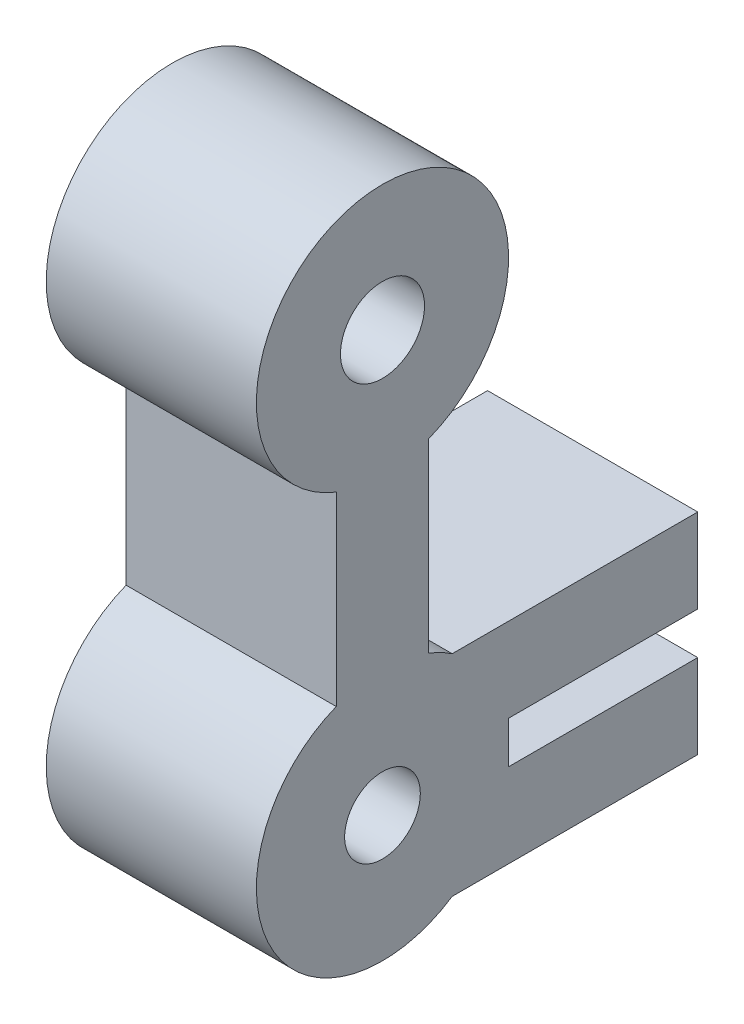
ISO-10303-21;
HEADER;
FILE_DESCRIPTION(('STEP AP214'),'2;1');
FILE_NAME('part.step','',(''),(''),'','','');
FILE_SCHEMA(('AUTOMOTIVE_DESIGN { 1 0 10303 214 1 1 1 1 }'));
ENDSEC;
DATA;
#1=APPLICATION_CONTEXT('core data for automotive mechanical design processes');
#2=APPLICATION_PROTOCOL_DEFINITION('international standard','automotive_design',2000,#1);
#3=PRODUCT_CONTEXT('',#1,'mechanical');
#4=PRODUCT('Part','Part','',(#3));
#5=PRODUCT_RELATED_PRODUCT_CATEGORY('part','',(#4));
#6=PRODUCT_DEFINITION_FORMATION('','',#4);
#7=PRODUCT_DEFINITION_CONTEXT('part definition',#1,'design');
#8=PRODUCT_DEFINITION('design','',#6,#7);
#9=PRODUCT_DEFINITION_SHAPE('','',#8);
#10=(LENGTH_UNIT() NAMED_UNIT(*) SI_UNIT(.MILLI.,.METRE.));
#11=(NAMED_UNIT(*) PLANE_ANGLE_UNIT() SI_UNIT($,.RADIAN.));
#12=(NAMED_UNIT(*) SI_UNIT($,.STERADIAN.) SOLID_ANGLE_UNIT());
#13=UNCERTAINTY_MEASURE_WITH_UNIT(LENGTH_MEASURE(1.E-05),#10,'distance_accuracy_value','');
#14=(GEOMETRIC_REPRESENTATION_CONTEXT(3) GLOBAL_UNCERTAINTY_ASSIGNED_CONTEXT((#13)) GLOBAL_UNIT_ASSIGNED_CONTEXT((#10,
#11,#12)) REPRESENTATION_CONTEXT('',''));
#15=CARTESIAN_POINT('',(0.,0.,0.));
#16=DIRECTION('',(0.,0.,1.));
#17=DIRECTION('',(1.,0.,0.));
#18=AXIS2_PLACEMENT_3D('',#15,#16,#17);
#19=CARTESIAN_POINT('',(-50.,25.,-75.));
#20=DIRECTION('',(0.,0.,-1.));
#21=DIRECTION('',(-1.,0.,0.));
#22=AXIS2_PLACEMENT_3D('',#19,#20,#21);
#23=PLANE('',#22);
#24=DIRECTION('',(0.,1.,0.));
#25=VECTOR('',#24,1.);
#26=CARTESIAN_POINT('',(0.,25.,-75.));
#27=LINE('',#26,#25);
#28=CARTESIAN_POINT('',(0.,4.99999999999996,-75.));
#29=VERTEX_POINT('',#28);
#30=CARTESIAN_POINT('',(0.,25.,-75.));
#31=VERTEX_POINT('',#30);
#32=EDGE_CURVE('E160',#29,#31,#27,.T.);
#33=ORIENTED_EDGE('',*,*,#32,.F.);
#34=DIRECTION('',(1.,0.,0.));
#35=VECTOR('',#34,1.);
#36=CARTESIAN_POINT('',(-50.,4.99999999999996,-75.));
#37=LINE('',#36,#35);
#38=CARTESIAN_POINT('',(-50.,4.99999999999996,-75.));
#39=VERTEX_POINT('',#38);
#40=EDGE_CURVE('E11',#39,#29,#37,.T.);
#41=ORIENTED_EDGE('',*,*,#40,.F.);
#42=DIRECTION('',(0.,1.,0.));
#43=VECTOR('',#42,1.);
#44=CARTESIAN_POINT('',(-50.,25.,-75.));
#45=LINE('',#44,#43);
#46=CARTESIAN_POINT('',(-50.,25.,-75.));
#47=VERTEX_POINT('',#46);
#48=EDGE_CURVE('E193',#39,#47,#45,.T.);
#49=ORIENTED_EDGE('',*,*,#48,.T.);
#50=DIRECTION('',(1.,0.,0.));
#51=VECTOR('',#50,1.);
#52=CARTESIAN_POINT('',(-50.,25.,-75.));
#53=LINE('',#52,#51);
#54=EDGE_CURVE('E42',#47,#31,#53,.T.);
#55=ORIENTED_EDGE('',*,*,#54,.T.);
#56=EDGE_LOOP('',(#33,#41,#49,#55));
#57=FACE_BOUND('',#56,.T.);
#58=ADVANCED_FACE('F39',(#57),#23,.T.);
#59=CARTESIAN_POINT('',(-50.,4.99999999999996,-75.));
#60=DIRECTION('',(0.,-1.,0.));
#61=DIRECTION('',(0.,0.,-1.));
#62=AXIS2_PLACEMENT_3D('',#59,#60,#61);
#63=PLANE('',#62);
#64=DIRECTION('',(0.,0.,-1.));
#65=VECTOR('',#64,1.);
#66=CARTESIAN_POINT('',(0.,4.99999999999996,-75.));
#67=LINE('',#66,#65);
#68=CARTESIAN_POINT('',(0.,4.99999999999996,-30.));
#69=VERTEX_POINT('',#68);
#70=EDGE_CURVE('E191',#69,#29,#67,.T.);
#71=ORIENTED_EDGE('',*,*,#70,.F.);
#72=DIRECTION('',(1.,0.,0.));
#73=VECTOR('',#72,1.);
#74=CARTESIAN_POINT('',(-50.,4.99999999999996,-30.));
#75=LINE('',#74,#73);
#76=CARTESIAN_POINT('',(-50.,4.99999999999996,-30.));
#77=VERTEX_POINT('',#76);
#78=EDGE_CURVE('E48',#77,#69,#75,.T.);
#79=ORIENTED_EDGE('',*,*,#78,.F.);
#80=DIRECTION('',(0.,0.,-1.));
#81=VECTOR('',#80,1.);
#82=CARTESIAN_POINT('',(-50.,4.99999999999996,-75.));
#83=LINE('',#82,#81);
#84=EDGE_CURVE('E150',#77,#39,#83,.T.);
#85=ORIENTED_EDGE('',*,*,#84,.T.);
#86=ORIENTED_EDGE('',*,*,#40,.T.);
#87=EDGE_LOOP('',(#71,#79,#85,#86));
#88=FACE_BOUND('',#87,.T.);
#89=ADVANCED_FACE('F213',(#88),#63,.T.);
#90=CARTESIAN_POINT('',(-50.,-4.99999999999996,-30.));
#91=DIRECTION('',(0.,0.,-1.));
#92=DIRECTION('',(-1.,0.,0.));
#93=AXIS2_PLACEMENT_3D('',#90,#91,#92);
#94=PLANE('',#93);
#95=DIRECTION('',(0.,1.,0.));
#96=VECTOR('',#95,1.);
#97=CARTESIAN_POINT('',(0.,-4.99999999999996,-30.));
#98=LINE('',#97,#96);
#99=CARTESIAN_POINT('',(0.,-4.99999999999996,-30.));
#100=VERTEX_POINT('',#99);
#101=EDGE_CURVE('E137',#100,#69,#98,.T.);
#102=ORIENTED_EDGE('',*,*,#101,.F.);
#103=DIRECTION('',(1.,0.,0.));
#104=VECTOR('',#103,1.);
#105=CARTESIAN_POINT('',(-50.,-4.99999999999996,-30.));
#106=LINE('',#105,#104);
#107=CARTESIAN_POINT('',(-50.,-4.99999999999996,-30.));
#108=VERTEX_POINT('',#107);
#109=EDGE_CURVE('E132',#108,#100,#106,.T.);
#110=ORIENTED_EDGE('',*,*,#109,.F.);
#111=DIRECTION('',(0.,1.,0.));
#112=VECTOR('',#111,1.);
#113=CARTESIAN_POINT('',(-50.,-4.99999999999996,-30.));
#114=LINE('',#113,#112);
#115=EDGE_CURVE('E135',#108,#77,#114,.T.);
#116=ORIENTED_EDGE('',*,*,#115,.T.);
#117=ORIENTED_EDGE('',*,*,#78,.T.);
#118=EDGE_LOOP('',(#102,#110,#116,#117));
#119=FACE_BOUND('',#118,.T.);
#120=ADVANCED_FACE('F134',(#119),#94,.T.);
#121=CARTESIAN_POINT('',(-50.,-4.99999999999996,-75.));
#122=DIRECTION('',(0.,1.,0.));
#123=DIRECTION('',(0.,0.,1.));
#124=AXIS2_PLACEMENT_3D('',#121,#122,#123);
#125=PLANE('',#124);
#126=DIRECTION('',(0.,0.,1.));
#127=VECTOR('',#126,1.);
#128=CARTESIAN_POINT('',(0.,-4.99999999999996,-75.));
#129=LINE('',#128,#127);
#130=CARTESIAN_POINT('',(0.,-4.99999999999996,-75.));
#131=VERTEX_POINT('',#130);
#132=EDGE_CURVE('E188',#131,#100,#129,.T.);
#133=ORIENTED_EDGE('',*,*,#132,.F.);
#134=DIRECTION('',(1.,0.,0.));
#135=VECTOR('',#134,1.);
#136=CARTESIAN_POINT('',(-50.,-4.99999999999996,-75.));
#137=LINE('',#136,#135);
#138=CARTESIAN_POINT('',(-50.,-4.99999999999996,-75.));
#139=VERTEX_POINT('',#138);
#140=EDGE_CURVE('E142',#139,#131,#137,.T.);
#141=ORIENTED_EDGE('',*,*,#140,.F.);
#142=DIRECTION('',(0.,0.,1.));
#143=VECTOR('',#142,1.);
#144=CARTESIAN_POINT('',(-50.,-4.99999999999996,-75.));
#145=LINE('',#144,#143);
#146=EDGE_CURVE('E148',#139,#108,#145,.T.);
#147=ORIENTED_EDGE('',*,*,#146,.T.);
#148=ORIENTED_EDGE('',*,*,#109,.T.);
#149=EDGE_LOOP('',(#133,#141,#147,#148));
#150=FACE_BOUND('',#149,.T.);
#151=ADVANCED_FACE('F152',(#150),#125,.T.);
#152=CARTESIAN_POINT('',(-50.,-25.,-75.));
#153=DIRECTION('',(0.,0.,-1.));
#154=DIRECTION('',(-1.,0.,0.));
#155=AXIS2_PLACEMENT_3D('',#152,#153,#154);
#156=PLANE('',#155);
#157=DIRECTION('',(0.,1.,0.));
#158=VECTOR('',#157,1.);
#159=CARTESIAN_POINT('',(0.,-25.,-75.));
#160=LINE('',#159,#158);
#161=CARTESIAN_POINT('',(0.,-25.,-75.));
#162=VERTEX_POINT('',#161);
#163=EDGE_CURVE('E185',#162,#131,#160,.T.);
#164=ORIENTED_EDGE('',*,*,#163,.F.);
#165=DIRECTION('',(1.,0.,0.));
#166=VECTOR('',#165,1.);
#167=CARTESIAN_POINT('',(-50.,-25.,-75.));
#168=LINE('',#167,#166);
#169=CARTESIAN_POINT('',(-50.,-25.,-75.));
#170=VERTEX_POINT('',#169);
#171=EDGE_CURVE('E197',#170,#162,#168,.T.);
#172=ORIENTED_EDGE('',*,*,#171,.F.);
#173=DIRECTION('',(0.,1.,0.));
#174=VECTOR('',#173,1.);
#175=CARTESIAN_POINT('',(-50.,-25.,-75.));
#176=LINE('',#175,#174);
#177=EDGE_CURVE('E153',#170,#139,#176,.T.);
#178=ORIENTED_EDGE('',*,*,#177,.T.);
#179=ORIENTED_EDGE('',*,*,#140,.T.);
#180=EDGE_LOOP('',(#164,#172,#178,#179));
#181=FACE_BOUND('',#180,.T.);
#182=ADVANCED_FACE('F226',(#181),#156,.T.);
#183=CARTESIAN_POINT('',(-50.,-25.,-16.583123951777));
#184=DIRECTION('',(0.,-1.,0.));
#185=DIRECTION('',(0.,0.,-1.));
#186=AXIS2_PLACEMENT_3D('',#183,#184,#185);
#187=PLANE('',#186);
#188=DIRECTION('',(0.,0.,-1.));
#189=VECTOR('',#188,1.);
#190=CARTESIAN_POINT('',(0.,-25.,-16.583123951777));
#191=LINE('',#190,#189);
#192=CARTESIAN_POINT('',(0.,-25.,-16.583123951777));
#193=VERTEX_POINT('',#192);
#194=EDGE_CURVE('E182',#193,#162,#191,.T.);
#195=ORIENTED_EDGE('',*,*,#194,.F.);
#196=DIRECTION('',(1.,0.,0.));
#197=VECTOR('',#196,1.);
#198=CARTESIAN_POINT('',(-50.,-25.,-16.583123951777));
#199=LINE('',#198,#197);
#200=CARTESIAN_POINT('',(-50.,-25.,-16.583123951777));
#201=VERTEX_POINT('',#200);
#202=EDGE_CURVE('E199',#201,#193,#199,.T.);
#203=ORIENTED_EDGE('',*,*,#202,.F.);
#204=DIRECTION('',(0.,0.,-1.));
#205=VECTOR('',#204,1.);
#206=CARTESIAN_POINT('',(-50.,-25.,-16.583123951777));
#207=LINE('',#206,#205);
#208=EDGE_CURVE('E155',#201,#170,#207,.T.);
#209=ORIENTED_EDGE('',*,*,#208,.T.);
#210=ORIENTED_EDGE('',*,*,#171,.T.);
#211=EDGE_LOOP('',(#195,#203,#209,#210));
#212=FACE_BOUND('',#211,.T.);
#213=ADVANCED_FACE('F229',(#212),#187,.T.);
#214=CARTESIAN_POINT('',(-50.,0.,0.));
#215=DIRECTION('',(1.,0.,0.));
#216=DIRECTION('',(0.,0.,-1.));
#217=AXIS2_PLACEMENT_3D('',#214,#215,#216);
#218=CYLINDRICAL_SURFACE('',#217,30.);
#219=CARTESIAN_POINT('',(0.,0.,0.));
#220=DIRECTION('',(1.,0.,0.));
#221=DIRECTION('',(0.,0.,-1.));
#222=AXIS2_PLACEMENT_3D('',#219,#220,#221);
#223=CIRCLE('',#222,30.);
#224=CARTESIAN_POINT('',(0.,27.9105714739057,11.));
#225=VERTEX_POINT('',#224);
#226=EDGE_CURVE('E179',#225,#193,#223,.T.);
#227=ORIENTED_EDGE('',*,*,#226,.F.);
#228=DIRECTION('',(1.,0.,0.));
#229=VECTOR('',#228,1.);
#230=CARTESIAN_POINT('',(-50.,27.9105714739057,11.));
#231=LINE('',#230,#229);
#232=CARTESIAN_POINT('',(-50.,27.9105714739057,11.));
#233=VERTEX_POINT('',#232);
#234=EDGE_CURVE('E201',#233,#225,#231,.T.);
#235=ORIENTED_EDGE('',*,*,#234,.F.);
#236=CARTESIAN_POINT('',(-50.,0.,0.));
#237=DIRECTION('',(1.,0.,0.));
#238=DIRECTION('',(0.,0.,-1.));
#239=AXIS2_PLACEMENT_3D('',#236,#237,#238);
#240=CIRCLE('',#239,30.);
#241=EDGE_CURVE('E303',#233,#201,#240,.T.);
#242=ORIENTED_EDGE('',*,*,#241,.T.);
#243=ORIENTED_EDGE('',*,*,#202,.T.);
#244=EDGE_LOOP('',(#227,#235,#242,#243));
#245=FACE_BOUND('',#244,.T.);
#246=ADVANCED_FACE('F233',(#245),#218,.T.);
#247=CARTESIAN_POINT('',(-50.,72.0894285260943,11.));
#248=DIRECTION('',(0.,0.,1.));
#249=DIRECTION('',(1.,0.,0.));
#250=AXIS2_PLACEMENT_3D('',#247,#248,#249);
#251=PLANE('',#250);
#252=DIRECTION('',(0.,-1.,0.));
#253=VECTOR('',#252,1.);
#254=CARTESIAN_POINT('',(0.,72.0894285260943,11.));
#255=LINE('',#254,#253);
#256=CARTESIAN_POINT('',(0.,72.0894285260943,11.));
#257=VERTEX_POINT('',#256);
#258=EDGE_CURVE('E176',#257,#225,#255,.T.);
#259=ORIENTED_EDGE('',*,*,#258,.F.);
#260=DIRECTION('',(1.,0.,0.));
#261=VECTOR('',#260,1.);
#262=CARTESIAN_POINT('',(-50.,72.0894285260943,11.));
#263=LINE('',#262,#261);
#264=CARTESIAN_POINT('',(-50.,72.0894285260943,11.));
#265=VERTEX_POINT('',#264);
#266=EDGE_CURVE('E203',#265,#257,#263,.T.);
#267=ORIENTED_EDGE('',*,*,#266,.F.);
#268=DIRECTION('',(0.,-1.,0.));
#269=VECTOR('',#268,1.);
#270=CARTESIAN_POINT('',(-50.,72.0894285260943,11.));
#271=LINE('',#270,#269);
#272=EDGE_CURVE('E300',#265,#233,#271,.T.);
#273=ORIENTED_EDGE('',*,*,#272,.T.);
#274=ORIENTED_EDGE('',*,*,#234,.T.);
#275=EDGE_LOOP('',(#259,#267,#273,#274));
#276=FACE_BOUND('',#275,.T.);
#277=ADVANCED_FACE('F237',(#276),#251,.T.);
#278=CARTESIAN_POINT('',(-50.,100.,0.));
#279=DIRECTION('',(1.,0.,0.));
#280=DIRECTION('',(0.,0.,-1.));
#281=AXIS2_PLACEMENT_3D('',#278,#279,#280);
#282=CYLINDRICAL_SURFACE('',#281,30.);
#283=CARTESIAN_POINT('',(0.,100.,0.));
#284=DIRECTION('',(1.,0.,0.));
#285=DIRECTION('',(0.,0.,-1.));
#286=AXIS2_PLACEMENT_3D('',#283,#284,#285);
#287=CIRCLE('',#286,30.);
#288=CARTESIAN_POINT('',(0.,72.0894285260943,-11.));
#289=VERTEX_POINT('',#288);
#290=EDGE_CURVE('E173',#289,#257,#287,.T.);
#291=ORIENTED_EDGE('',*,*,#290,.F.);
#292=DIRECTION('',(1.,0.,0.));
#293=VECTOR('',#292,1.);
#294=CARTESIAN_POINT('',(-50.,72.0894285260943,-11.));
#295=LINE('',#294,#293);
#296=CARTESIAN_POINT('',(-50.,72.0894285260943,-11.));
#297=VERTEX_POINT('',#296);
#298=EDGE_CURVE('E205',#297,#289,#295,.T.);
#299=ORIENTED_EDGE('',*,*,#298,.F.);
#300=CARTESIAN_POINT('',(-50.,100.,0.));
#301=DIRECTION('',(1.,0.,0.));
#302=DIRECTION('',(0.,0.,-1.));
#303=AXIS2_PLACEMENT_3D('',#300,#301,#302);
#304=CIRCLE('',#303,30.);
#305=EDGE_CURVE('E297',#297,#265,#304,.T.);
#306=ORIENTED_EDGE('',*,*,#305,.T.);
#307=ORIENTED_EDGE('',*,*,#266,.T.);
#308=EDGE_LOOP('',(#291,#299,#306,#307));
#309=FACE_BOUND('',#308,.T.);
#310=ADVANCED_FACE('F241',(#309),#282,.T.);
#311=CARTESIAN_POINT('',(-50.,72.0894285260943,-11.));
#312=DIRECTION('',(0.,0.,-1.));
#313=DIRECTION('',(-1.,0.,0.));
#314=AXIS2_PLACEMENT_3D('',#311,#312,#313);
#315=PLANE('',#314);
#316=DIRECTION('',(0.,1.,0.));
#317=VECTOR('',#316,1.);
#318=CARTESIAN_POINT('',(0.,72.0894285260943,-11.));
#319=LINE('',#318,#317);
#320=CARTESIAN_POINT('',(0.,27.9105714739057,-11.));
#321=VERTEX_POINT('',#320);
#322=EDGE_CURVE('E170',#321,#289,#319,.T.);
#323=ORIENTED_EDGE('',*,*,#322,.F.);
#324=DIRECTION('',(1.,0.,0.));
#325=VECTOR('',#324,1.);
#326=CARTESIAN_POINT('',(-50.,27.9105714739057,-11.));
#327=LINE('',#326,#325);
#328=CARTESIAN_POINT('',(-50.,27.9105714739057,-11.));
#329=VERTEX_POINT('',#328);
#330=EDGE_CURVE('E207',#329,#321,#327,.T.);
#331=ORIENTED_EDGE('',*,*,#330,.F.);
#332=DIRECTION('',(0.,1.,0.));
#333=VECTOR('',#332,1.);
#334=CARTESIAN_POINT('',(-50.,72.0894285260943,-11.));
#335=LINE('',#334,#333);
#336=EDGE_CURVE('E294',#329,#297,#335,.T.);
#337=ORIENTED_EDGE('',*,*,#336,.T.);
#338=ORIENTED_EDGE('',*,*,#298,.T.);
#339=EDGE_LOOP('',(#323,#331,#337,#338));
#340=FACE_BOUND('',#339,.T.);
#341=ADVANCED_FACE('F245',(#340),#315,.T.);
#342=CARTESIAN_POINT('',(-50.,0.,0.));
#343=DIRECTION('',(1.,0.,0.));
#344=DIRECTION('',(0.,0.,-1.));
#345=AXIS2_PLACEMENT_3D('',#342,#343,#344);
#346=CYLINDRICAL_SURFACE('',#345,30.);
#347=CARTESIAN_POINT('',(0.,0.,0.));
#348=DIRECTION('',(1.,0.,0.));
#349=DIRECTION('',(0.,0.,-1.));
#350=AXIS2_PLACEMENT_3D('',#347,#348,#349);
#351=CIRCLE('',#350,30.);
#352=CARTESIAN_POINT('',(0.,25.,-16.583123951777));
#353=VERTEX_POINT('',#352);
#354=EDGE_CURVE('E167',#353,#321,#351,.T.);
#355=ORIENTED_EDGE('',*,*,#354,.F.);
#356=DIRECTION('',(1.,0.,0.));
#357=VECTOR('',#356,1.);
#358=CARTESIAN_POINT('',(-50.,25.,-16.583123951777));
#359=LINE('',#358,#357);
#360=CARTESIAN_POINT('',(-50.,25.,-16.583123951777));
#361=VERTEX_POINT('',#360);
#362=EDGE_CURVE('E208',#361,#353,#359,.T.);
#363=ORIENTED_EDGE('',*,*,#362,.F.);
#364=CARTESIAN_POINT('',(-50.,0.,0.));
#365=DIRECTION('',(1.,0.,0.));
#366=DIRECTION('',(0.,0.,-1.));
#367=AXIS2_PLACEMENT_3D('',#364,#365,#366);
#368=CIRCLE('',#367,30.);
#369=EDGE_CURVE('E291',#361,#329,#368,.T.);
#370=ORIENTED_EDGE('',*,*,#369,.T.);
#371=ORIENTED_EDGE('',*,*,#330,.T.);
#372=EDGE_LOOP('',(#355,#363,#370,#371));
#373=FACE_BOUND('',#372,.T.);
#374=ADVANCED_FACE('F249',(#373),#346,.T.);
#375=CARTESIAN_POINT('',(-50.,25.,-16.583123951777));
#376=DIRECTION('',(0.,1.,0.));
#377=DIRECTION('',(0.,0.,1.));
#378=AXIS2_PLACEMENT_3D('',#375,#376,#377);
#379=PLANE('',#378);
#380=DIRECTION('',(0.,0.,1.));
#381=VECTOR('',#380,1.);
#382=CARTESIAN_POINT('',(0.,25.,-16.583123951777));
#383=LINE('',#382,#381);
#384=EDGE_CURVE('E163',#31,#353,#383,.T.);
#385=ORIENTED_EDGE('',*,*,#384,.F.);
#386=ORIENTED_EDGE('',*,*,#54,.F.);
#387=DIRECTION('',(0.,0.,1.));
#388=VECTOR('',#387,1.);
#389=CARTESIAN_POINT('',(-50.,25.,-16.583123951777));
#390=LINE('',#389,#388);
#391=EDGE_CURVE('E289',#47,#361,#390,.T.);
#392=ORIENTED_EDGE('',*,*,#391,.T.);
#393=ORIENTED_EDGE('',*,*,#362,.T.);
#394=EDGE_LOOP('',(#385,#386,#392,#393));
#395=FACE_BOUND('',#394,.T.);
#396=ADVANCED_FACE('F210',(#395),#379,.T.);
#397=CARTESIAN_POINT('',(-50.,0.,0.));
#398=DIRECTION('',(1.,0.,0.));
#399=DIRECTION('',(0.,0.,-1.));
#400=AXIS2_PLACEMENT_3D('',#397,#398,#399);
#401=PLANE('',#400);
#402=CARTESIAN_POINT('',(-50.,100.,0.));
#403=DIRECTION('',(1.,0.,0.));
#404=DIRECTION('',(0.,0.,-1.));
#405=AXIS2_PLACEMENT_3D('',#402,#403,#404);
#406=CIRCLE('',#405,9.99999999999999);
#407=CARTESIAN_POINT('',(-50.,100.,-9.99999999999999));
#408=VERTEX_POINT('',#407);
#409=EDGE_CURVE('E276',#408,#408,#406,.T.);
#410=ORIENTED_EDGE('',*,*,#409,.T.);
#411=EDGE_LOOP('',(#410));
#412=FACE_BOUND('',#411,.T.);
#413=CARTESIAN_POINT('',(-50.,0.,0.));
#414=DIRECTION('',(1.,0.,0.));
#415=DIRECTION('',(0.,0.,-1.));
#416=AXIS2_PLACEMENT_3D('',#413,#414,#415);
#417=CIRCLE('',#416,9.);
#418=CARTESIAN_POINT('',(-50.,0.,-9.));
#419=VERTEX_POINT('',#418);
#420=EDGE_CURVE('E164',#419,#419,#417,.T.);
#421=ORIENTED_EDGE('',*,*,#420,.T.);
#422=EDGE_LOOP('',(#421));
#423=FACE_BOUND('',#422,.T.);
#424=ORIENTED_EDGE('',*,*,#48,.F.);
#425=ORIENTED_EDGE('',*,*,#84,.F.);
#426=ORIENTED_EDGE('',*,*,#115,.F.);
#427=ORIENTED_EDGE('',*,*,#146,.F.);
#428=ORIENTED_EDGE('',*,*,#177,.F.);
#429=ORIENTED_EDGE('',*,*,#208,.F.);
#430=ORIENTED_EDGE('',*,*,#241,.F.);
#431=ORIENTED_EDGE('',*,*,#272,.F.);
#432=ORIENTED_EDGE('',*,*,#305,.F.);
#433=ORIENTED_EDGE('',*,*,#336,.F.);
#434=ORIENTED_EDGE('',*,*,#369,.F.);
#435=ORIENTED_EDGE('',*,*,#391,.F.);
#436=EDGE_LOOP('',(#424,#425,#426,#427,#428,#429,#430,#431,#432,#433,#434,#435));
#437=FACE_BOUND('',#436,.T.);
#438=ADVANCED_FACE('F146',(#412,#423,#437),#401,.F.);
#439=CARTESIAN_POINT('',(0.,0.,0.));
#440=DIRECTION('',(1.,0.,0.));
#441=DIRECTION('',(0.,0.,-1.));
#442=AXIS2_PLACEMENT_3D('',#439,#440,#441);
#443=PLANE('',#442);
#444=CARTESIAN_POINT('',(0.,100.,0.));
#445=DIRECTION('',(1.,0.,0.));
#446=DIRECTION('',(0.,0.,-1.));
#447=AXIS2_PLACEMENT_3D('',#444,#445,#446);
#448=CIRCLE('',#447,9.99999999999999);
#449=CARTESIAN_POINT('',(0.,100.,-9.99999999999999));
#450=VERTEX_POINT('',#449);
#451=EDGE_CURVE('E279',#450,#450,#448,.T.);
#452=ORIENTED_EDGE('',*,*,#451,.F.);
#453=EDGE_LOOP('',(#452));
#454=FACE_BOUND('',#453,.T.);
#455=CARTESIAN_POINT('',(0.,0.,0.));
#456=DIRECTION('',(1.,0.,0.));
#457=DIRECTION('',(0.,0.,-1.));
#458=AXIS2_PLACEMENT_3D('',#455,#456,#457);
#459=CIRCLE('',#458,9.);
#460=CARTESIAN_POINT('',(0.,0.,-9.));
#461=VERTEX_POINT('',#460);
#462=EDGE_CURVE('E281',#461,#461,#459,.T.);
#463=ORIENTED_EDGE('',*,*,#462,.F.);
#464=EDGE_LOOP('',(#463));
#465=FACE_BOUND('',#464,.T.);
#466=ORIENTED_EDGE('',*,*,#32,.T.);
#467=ORIENTED_EDGE('',*,*,#384,.T.);
#468=ORIENTED_EDGE('',*,*,#354,.T.);
#469=ORIENTED_EDGE('',*,*,#322,.T.);
#470=ORIENTED_EDGE('',*,*,#290,.T.);
#471=ORIENTED_EDGE('',*,*,#258,.T.);
#472=ORIENTED_EDGE('',*,*,#226,.T.);
#473=ORIENTED_EDGE('',*,*,#194,.T.);
#474=ORIENTED_EDGE('',*,*,#163,.T.);
#475=ORIENTED_EDGE('',*,*,#132,.T.);
#476=ORIENTED_EDGE('',*,*,#101,.T.);
#477=ORIENTED_EDGE('',*,*,#70,.T.);
#478=EDGE_LOOP('',(#466,#467,#468,#469,#470,#471,#472,#473,#474,#475,#476,#477));
#479=FACE_BOUND('',#478,.T.);
#480=ADVANCED_FACE('F212',(#454,#465,#479),#443,.T.);
#481=CARTESIAN_POINT('',(-50.,0.,0.));
#482=DIRECTION('',(1.,0.,0.));
#483=DIRECTION('',(0.,0.,-1.));
#484=AXIS2_PLACEMENT_3D('',#481,#482,#483);
#485=CYLINDRICAL_SURFACE('',#484,9.);
#486=ORIENTED_EDGE('',*,*,#420,.F.);
#487=EDGE_LOOP('',(#486));
#488=FACE_BOUND('',#487,.T.);
#489=ORIENTED_EDGE('',*,*,#462,.T.);
#490=EDGE_LOOP('',(#489));
#491=FACE_BOUND('',#490,.T.);
#492=ADVANCED_FACE('F261',(#488,#491),#485,.F.);
#493=CARTESIAN_POINT('',(-50.,100.,0.));
#494=DIRECTION('',(1.,0.,0.));
#495=DIRECTION('',(0.,0.,-1.));
#496=AXIS2_PLACEMENT_3D('',#493,#494,#495);
#497=CYLINDRICAL_SURFACE('',#496,9.99999999999999);
#498=ORIENTED_EDGE('',*,*,#409,.F.);
#499=EDGE_LOOP('',(#498));
#500=FACE_BOUND('',#499,.T.);
#501=ORIENTED_EDGE('',*,*,#451,.T.);
#502=EDGE_LOOP('',(#501));
#503=FACE_BOUND('',#502,.T.);
#504=ADVANCED_FACE('F268',(#500,#503),#497,.F.);
#505=CLOSED_SHELL('',(#58,#89,#120,#151,#182,#213,#246,#277,#310,#341,#374,#396,#438,#480,#492,#504));
#506=MANIFOLD_SOLID_BREP('B2',#505);
#507=ADVANCED_BREP_SHAPE_REPRESENTATION('',(#18,#506),#14);
#508=SHAPE_DEFINITION_REPRESENTATION(#9,#507);
ENDSEC;
END-ISO-10303-21;
